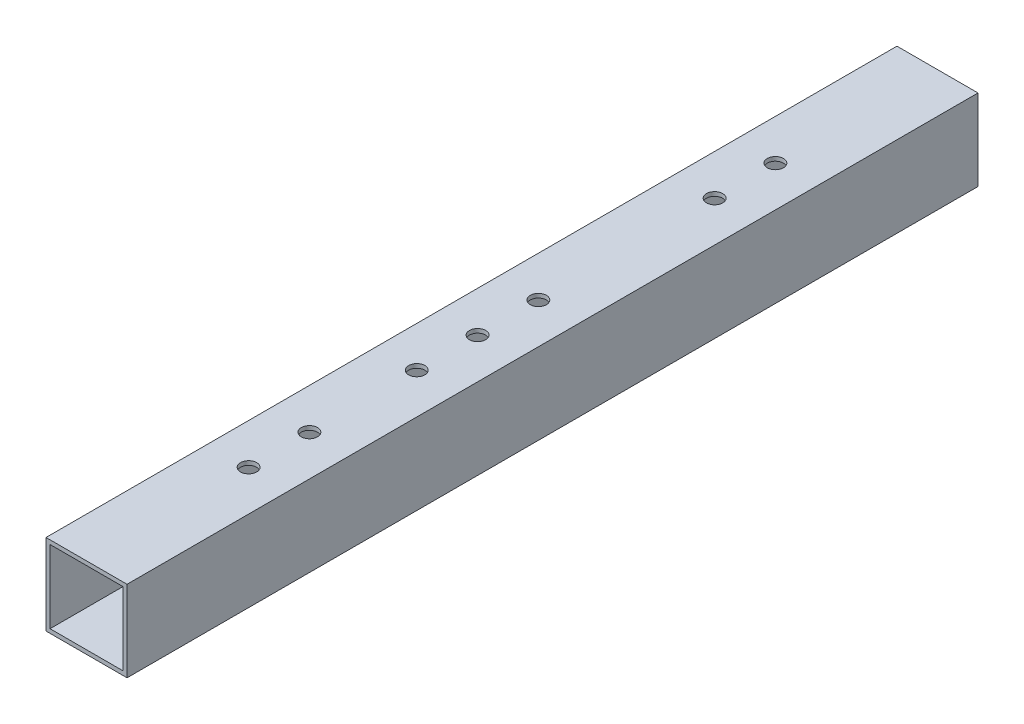
ISO-10303-21;
HEADER;
FILE_DESCRIPTION(('STEP AP214'),'2;1');
FILE_NAME('part.step','',(''),(''),'','','');
FILE_SCHEMA(('AUTOMOTIVE_DESIGN { 1 0 10303 214 1 1 1 1 }'));
ENDSEC;
DATA;
#1=APPLICATION_CONTEXT('core data for automotive mechanical design processes');
#2=APPLICATION_PROTOCOL_DEFINITION('international standard','automotive_design',2000,#1);
#3=PRODUCT_CONTEXT('',#1,'mechanical');
#4=PRODUCT('Part','Part','',(#3));
#5=PRODUCT_RELATED_PRODUCT_CATEGORY('part','',(#4));
#6=PRODUCT_DEFINITION_FORMATION('','',#4);
#7=PRODUCT_DEFINITION_CONTEXT('part definition',#1,'design');
#8=PRODUCT_DEFINITION('design','',#6,#7);
#9=PRODUCT_DEFINITION_SHAPE('','',#8);
#10=(LENGTH_UNIT() NAMED_UNIT(*) SI_UNIT(.MILLI.,.METRE.));
#11=(NAMED_UNIT(*) PLANE_ANGLE_UNIT() SI_UNIT($,.RADIAN.));
#12=(NAMED_UNIT(*) SI_UNIT($,.STERADIAN.) SOLID_ANGLE_UNIT());
#13=UNCERTAINTY_MEASURE_WITH_UNIT(LENGTH_MEASURE(1.E-05),#10,'distance_accuracy_value','');
#14=(GEOMETRIC_REPRESENTATION_CONTEXT(3) GLOBAL_UNCERTAINTY_ASSIGNED_CONTEXT((#13)) GLOBAL_UNIT_ASSIGNED_CONTEXT((#10,
#11,#12)) REPRESENTATION_CONTEXT('',''));
#15=CARTESIAN_POINT('',(0.,0.,0.));
#16=DIRECTION('',(0.,0.,1.));
#17=DIRECTION('',(1.,0.,0.));
#18=AXIS2_PLACEMENT_3D('',#15,#16,#17);
#19=CARTESIAN_POINT('',(0.,0.,105.));
#20=DIRECTION('',(0.,0.,-1.));
#21=DIRECTION('',(-1.,0.,0.));
#22=AXIS2_PLACEMENT_3D('',#19,#20,#21);
#23=PLANE('',#22);
#24=DIRECTION('',(0.,1.,0.));
#25=VECTOR('',#24,1.);
#26=CARTESIAN_POINT('',(10.,-10.,105.));
#27=LINE('',#26,#25);
#28=CARTESIAN_POINT('',(10.,-10.,105.));
#29=VERTEX_POINT('',#28);
#30=CARTESIAN_POINT('',(10.,10.,105.));
#31=VERTEX_POINT('',#30);
#32=EDGE_CURVE('E148',#29,#31,#27,.T.);
#33=ORIENTED_EDGE('',*,*,#32,.T.);
#34=DIRECTION('',(-1.,0.,0.));
#35=VECTOR('',#34,1.);
#36=CARTESIAN_POINT('',(-10.,10.,105.));
#37=LINE('',#36,#35);
#38=CARTESIAN_POINT('',(-10.,10.,105.));
#39=VERTEX_POINT('',#38);
#40=EDGE_CURVE('E151',#31,#39,#37,.T.);
#41=ORIENTED_EDGE('',*,*,#40,.T.);
#42=DIRECTION('',(0.,-1.,0.));
#43=VECTOR('',#42,1.);
#44=CARTESIAN_POINT('',(-10.,-10.,105.));
#45=LINE('',#44,#43);
#46=CARTESIAN_POINT('',(-10.,-10.,105.));
#47=VERTEX_POINT('',#46);
#48=EDGE_CURVE('E154',#39,#47,#45,.T.);
#49=ORIENTED_EDGE('',*,*,#48,.T.);
#50=DIRECTION('',(1.,0.,0.));
#51=VECTOR('',#50,1.);
#52=CARTESIAN_POINT('',(-10.,-10.,105.));
#53=LINE('',#52,#51);
#54=EDGE_CURVE('E156',#47,#29,#53,.T.);
#55=ORIENTED_EDGE('',*,*,#54,.T.);
#56=EDGE_LOOP('',(#33,#41,#49,#55));
#57=FACE_BOUND('',#56,.T.);
#58=DIRECTION('',(0.,1.,0.));
#59=VECTOR('',#58,1.);
#60=CARTESIAN_POINT('',(9.,9.,105.));
#61=LINE('',#60,#59);
#62=CARTESIAN_POINT('',(9.,-9.,105.));
#63=VERTEX_POINT('',#62);
#64=CARTESIAN_POINT('',(9.,9.,105.));
#65=VERTEX_POINT('',#64);
#66=EDGE_CURVE('E110',#63,#65,#61,.T.);
#67=ORIENTED_EDGE('',*,*,#66,.F.);
#68=DIRECTION('',(1.,0.,0.));
#69=VECTOR('',#68,1.);
#70=CARTESIAN_POINT('',(-9.,-9.,105.));
#71=LINE('',#70,#69);
#72=CARTESIAN_POINT('',(-9.,-9.,105.));
#73=VERTEX_POINT('',#72);
#74=EDGE_CURVE('E132',#73,#63,#71,.T.);
#75=ORIENTED_EDGE('',*,*,#74,.F.);
#76=DIRECTION('',(0.,-1.,0.));
#77=VECTOR('',#76,1.);
#78=CARTESIAN_POINT('',(-9.,9.,105.));
#79=LINE('',#78,#77);
#80=CARTESIAN_POINT('',(-9.,9.,105.));
#81=VERTEX_POINT('',#80);
#82=EDGE_CURVE('E130',#81,#73,#79,.T.);
#83=ORIENTED_EDGE('',*,*,#82,.F.);
#84=DIRECTION('',(-1.,0.,0.));
#85=VECTOR('',#84,1.);
#86=CARTESIAN_POINT('',(-9.,9.,105.));
#87=LINE('',#86,#85);
#88=EDGE_CURVE('E118',#65,#81,#87,.T.);
#89=ORIENTED_EDGE('',*,*,#88,.F.);
#90=EDGE_LOOP('',(#67,#75,#83,#89));
#91=FACE_BOUND('',#90,.T.);
#92=ADVANCED_FACE('F43',(#57,#91),#23,.F.);
#93=CARTESIAN_POINT('',(0.,0.,-105.));
#94=DIRECTION('',(0.,0.,-1.));
#95=DIRECTION('',(-1.,0.,0.));
#96=AXIS2_PLACEMENT_3D('',#93,#94,#95);
#97=PLANE('',#96);
#98=DIRECTION('',(0.,1.,0.));
#99=VECTOR('',#98,1.);
#100=CARTESIAN_POINT('',(10.,-10.,-105.));
#101=LINE('',#100,#99);
#102=CARTESIAN_POINT('',(10.,-10.,-105.));
#103=VERTEX_POINT('',#102);
#104=CARTESIAN_POINT('',(10.,10.,-105.));
#105=VERTEX_POINT('',#104);
#106=EDGE_CURVE('E126',#103,#105,#101,.T.);
#107=ORIENTED_EDGE('',*,*,#106,.F.);
#108=DIRECTION('',(1.,0.,0.));
#109=VECTOR('',#108,1.);
#110=CARTESIAN_POINT('',(-10.,-10.,-105.));
#111=LINE('',#110,#109);
#112=CARTESIAN_POINT('',(-10.,-10.,-105.));
#113=VERTEX_POINT('',#112);
#114=EDGE_CURVE('E152',#113,#103,#111,.T.);
#115=ORIENTED_EDGE('',*,*,#114,.F.);
#116=DIRECTION('',(0.,-1.,0.));
#117=VECTOR('',#116,1.);
#118=CARTESIAN_POINT('',(-10.,-10.,-105.));
#119=LINE('',#118,#117);
#120=CARTESIAN_POINT('',(-10.,10.,-105.));
#121=VERTEX_POINT('',#120);
#122=EDGE_CURVE('E163',#121,#113,#119,.T.);
#123=ORIENTED_EDGE('',*,*,#122,.F.);
#124=DIRECTION('',(-1.,0.,0.));
#125=VECTOR('',#124,1.);
#126=CARTESIAN_POINT('',(-10.,10.,-105.));
#127=LINE('',#126,#125);
#128=EDGE_CURVE('E161',#105,#121,#127,.T.);
#129=ORIENTED_EDGE('',*,*,#128,.F.);
#130=EDGE_LOOP('',(#107,#115,#123,#129));
#131=FACE_BOUND('',#130,.T.);
#132=DIRECTION('',(1.,0.,0.));
#133=VECTOR('',#132,1.);
#134=CARTESIAN_POINT('',(-9.,-9.,-105.));
#135=LINE('',#134,#133);
#136=CARTESIAN_POINT('',(-9.,-9.,-105.));
#137=VERTEX_POINT('',#136);
#138=CARTESIAN_POINT('',(9.,-9.,-105.));
#139=VERTEX_POINT('',#138);
#140=EDGE_CURVE('E119',#137,#139,#135,.T.);
#141=ORIENTED_EDGE('',*,*,#140,.T.);
#142=DIRECTION('',(0.,1.,0.));
#143=VECTOR('',#142,1.);
#144=CARTESIAN_POINT('',(9.,9.,-105.));
#145=LINE('',#144,#143);
#146=CARTESIAN_POINT('',(9.,9.,-105.));
#147=VERTEX_POINT('',#146);
#148=EDGE_CURVE('E68',#139,#147,#145,.T.);
#149=ORIENTED_EDGE('',*,*,#148,.T.);
#150=DIRECTION('',(-1.,0.,0.));
#151=VECTOR('',#150,1.);
#152=CARTESIAN_POINT('',(-9.,9.,-105.));
#153=LINE('',#152,#151);
#154=CARTESIAN_POINT('',(-9.,9.,-105.));
#155=VERTEX_POINT('',#154);
#156=EDGE_CURVE('E125',#147,#155,#153,.T.);
#157=ORIENTED_EDGE('',*,*,#156,.T.);
#158=DIRECTION('',(0.,-1.,0.));
#159=VECTOR('',#158,1.);
#160=CARTESIAN_POINT('',(-9.,9.,-105.));
#161=LINE('',#160,#159);
#162=EDGE_CURVE('E140',#155,#137,#161,.T.);
#163=ORIENTED_EDGE('',*,*,#162,.T.);
#164=EDGE_LOOP('',(#141,#149,#157,#163));
#165=FACE_BOUND('',#164,.T.);
#166=ADVANCED_FACE('F279',(#131,#165),#97,.T.);
#167=CARTESIAN_POINT('',(10.,-10.,105.));
#168=DIRECTION('',(-1.,0.,0.));
#169=DIRECTION('',(0.,-1.,0.));
#170=AXIS2_PLACEMENT_3D('',#167,#168,#169);
#171=PLANE('',#170);
#172=ORIENTED_EDGE('',*,*,#106,.T.);
#173=DIRECTION('',(0.,0.,-1.));
#174=VECTOR('',#173,1.);
#175=CARTESIAN_POINT('',(10.,10.,105.));
#176=LINE('',#175,#174);
#177=EDGE_CURVE('E11',#31,#105,#176,.T.);
#178=ORIENTED_EDGE('',*,*,#177,.F.);
#179=ORIENTED_EDGE('',*,*,#32,.F.);
#180=DIRECTION('',(0.,0.,-1.));
#181=VECTOR('',#180,1.);
#182=CARTESIAN_POINT('',(10.,-10.,105.));
#183=LINE('',#182,#181);
#184=EDGE_CURVE('E158',#29,#103,#183,.T.);
#185=ORIENTED_EDGE('',*,*,#184,.T.);
#186=EDGE_LOOP('',(#172,#178,#179,#185));
#187=FACE_BOUND('',#186,.T.);
#188=ADVANCED_FACE('F45',(#187),#171,.F.);
#189=CARTESIAN_POINT('',(-10.,10.,105.));
#190=DIRECTION('',(0.,-1.,0.));
#191=DIRECTION('',(1.,0.,0.));
#192=AXIS2_PLACEMENT_3D('',#189,#190,#191);
#193=PLANE('',#192);
#194=CARTESIAN_POINT('',(0.,10.,23.5));
#195=DIRECTION('',(0.,1.,0.));
#196=DIRECTION('',(-1.,0.,0.));
#197=AXIS2_PLACEMENT_3D('',#194,#195,#196);
#198=CIRCLE('',#197,2.);
#199=CARTESIAN_POINT('',(-2.,10.,23.5));
#200=VERTEX_POINT('',#199);
#201=EDGE_CURVE('E543',#200,#200,#198,.T.);
#202=ORIENTED_EDGE('',*,*,#201,.F.);
#203=EDGE_LOOP('',(#202));
#204=FACE_BOUND('',#203,.T.);
#205=CARTESIAN_POINT('',(0.,10.,-6.50000000000001));
#206=DIRECTION('',(0.,1.,0.));
#207=DIRECTION('',(-1.,0.,0.));
#208=AXIS2_PLACEMENT_3D('',#205,#206,#207);
#209=CIRCLE('',#208,2.);
#210=CARTESIAN_POINT('',(-2.,10.,-6.50000000000001));
#211=VERTEX_POINT('',#210);
#212=EDGE_CURVE('E548',#211,#211,#209,.T.);
#213=ORIENTED_EDGE('',*,*,#212,.F.);
#214=EDGE_LOOP('',(#213));
#215=FACE_BOUND('',#214,.T.);
#216=CARTESIAN_POINT('',(0.,10.,8.49999999999999));
#217=DIRECTION('',(0.,1.,0.));
#218=DIRECTION('',(-1.,0.,0.));
#219=AXIS2_PLACEMENT_3D('',#216,#217,#218);
#220=CIRCLE('',#219,2.);
#221=CARTESIAN_POINT('',(-2.,10.,8.49999999999999));
#222=VERTEX_POINT('',#221);
#223=EDGE_CURVE('E205',#222,#222,#220,.T.);
#224=ORIENTED_EDGE('',*,*,#223,.F.);
#225=EDGE_LOOP('',(#224));
#226=FACE_BOUND('',#225,.T.);
#227=CARTESIAN_POINT('',(0.,10.,-65.));
#228=DIRECTION('',(0.,1.,0.));
#229=DIRECTION('',(-1.,0.,0.));
#230=AXIS2_PLACEMENT_3D('',#227,#228,#229);
#231=CIRCLE('',#230,2.);
#232=CARTESIAN_POINT('',(-2.,10.,-65.));
#233=VERTEX_POINT('',#232);
#234=EDGE_CURVE('E214',#233,#233,#231,.T.);
#235=ORIENTED_EDGE('',*,*,#234,.F.);
#236=EDGE_LOOP('',(#235));
#237=FACE_BOUND('',#236,.T.);
#238=CARTESIAN_POINT('',(0.,10.,65.));
#239=DIRECTION('',(0.,1.,0.));
#240=DIRECTION('',(-1.,0.,0.));
#241=AXIS2_PLACEMENT_3D('',#238,#239,#240);
#242=CIRCLE('',#241,2.);
#243=CARTESIAN_POINT('',(-2.00000000000001,10.,65.));
#244=VERTEX_POINT('',#243);
#245=EDGE_CURVE('E217',#244,#244,#242,.T.);
#246=ORIENTED_EDGE('',*,*,#245,.F.);
#247=EDGE_LOOP('',(#246));
#248=FACE_BOUND('',#247,.T.);
#249=CARTESIAN_POINT('',(0.,10.,50.));
#250=DIRECTION('',(0.,1.,0.));
#251=DIRECTION('',(-1.,0.,0.));
#252=AXIS2_PLACEMENT_3D('',#249,#250,#251);
#253=CIRCLE('',#252,2.);
#254=CARTESIAN_POINT('',(-2.,10.,50.));
#255=VERTEX_POINT('',#254);
#256=EDGE_CURVE('E223',#255,#255,#253,.T.);
#257=ORIENTED_EDGE('',*,*,#256,.F.);
#258=EDGE_LOOP('',(#257));
#259=FACE_BOUND('',#258,.T.);
#260=CARTESIAN_POINT('',(0.,10.,-50.));
#261=DIRECTION('',(0.,1.,0.));
#262=DIRECTION('',(-1.,0.,0.));
#263=AXIS2_PLACEMENT_3D('',#260,#261,#262);
#264=CIRCLE('',#263,2.);
#265=CARTESIAN_POINT('',(-2.,10.,-50.));
#266=VERTEX_POINT('',#265);
#267=EDGE_CURVE('E229',#266,#266,#264,.T.);
#268=ORIENTED_EDGE('',*,*,#267,.F.);
#269=EDGE_LOOP('',(#268));
#270=FACE_BOUND('',#269,.T.);
#271=ORIENTED_EDGE('',*,*,#128,.T.);
#272=DIRECTION('',(0.,0.,-1.));
#273=VECTOR('',#272,1.);
#274=CARTESIAN_POINT('',(-10.,10.,105.));
#275=LINE('',#274,#273);
#276=EDGE_CURVE('E52',#39,#121,#275,.T.);
#277=ORIENTED_EDGE('',*,*,#276,.F.);
#278=ORIENTED_EDGE('',*,*,#40,.F.);
#279=ORIENTED_EDGE('',*,*,#177,.T.);
#280=EDGE_LOOP('',(#271,#277,#278,#279));
#281=FACE_BOUND('',#280,.T.);
#282=ADVANCED_FACE('F265',(#204,#215,#226,#237,#248,#259,#270,#281),#193,.F.);
#283=CARTESIAN_POINT('',(-10.,-10.,105.));
#284=DIRECTION('',(1.,0.,0.));
#285=DIRECTION('',(0.,1.,0.));
#286=AXIS2_PLACEMENT_3D('',#283,#284,#285);
#287=PLANE('',#286);
#288=ORIENTED_EDGE('',*,*,#122,.T.);
#289=DIRECTION('',(0.,0.,-1.));
#290=VECTOR('',#289,1.);
#291=CARTESIAN_POINT('',(-10.,-10.,105.));
#292=LINE('',#291,#290);
#293=EDGE_CURVE('E168',#47,#113,#292,.T.);
#294=ORIENTED_EDGE('',*,*,#293,.F.);
#295=ORIENTED_EDGE('',*,*,#48,.F.);
#296=ORIENTED_EDGE('',*,*,#276,.T.);
#297=EDGE_LOOP('',(#288,#294,#295,#296));
#298=FACE_BOUND('',#297,.T.);
#299=ADVANCED_FACE('F268',(#298),#287,.F.);
#300=CARTESIAN_POINT('',(-10.,-10.,105.));
#301=DIRECTION('',(0.,1.,0.));
#302=DIRECTION('',(-1.,0.,0.));
#303=AXIS2_PLACEMENT_3D('',#300,#301,#302);
#304=PLANE('',#303);
#305=CARTESIAN_POINT('',(0.,-10.,23.5));
#306=DIRECTION('',(0.,1.,0.));
#307=DIRECTION('',(-1.,0.,0.));
#308=AXIS2_PLACEMENT_3D('',#305,#306,#307);
#309=CIRCLE('',#308,2.);
#310=CARTESIAN_POINT('',(-2.,-10.,23.5));
#311=VERTEX_POINT('',#310);
#312=EDGE_CURVE('E545',#311,#311,#309,.T.);
#313=ORIENTED_EDGE('',*,*,#312,.T.);
#314=EDGE_LOOP('',(#313));
#315=FACE_BOUND('',#314,.T.);
#316=CARTESIAN_POINT('',(0.,-10.,-6.50000000000001));
#317=DIRECTION('',(0.,1.,0.));
#318=DIRECTION('',(-1.,0.,0.));
#319=AXIS2_PLACEMENT_3D('',#316,#317,#318);
#320=CIRCLE('',#319,2.);
#321=CARTESIAN_POINT('',(-2.,-10.,-6.50000000000001));
#322=VERTEX_POINT('',#321);
#323=EDGE_CURVE('E544',#322,#322,#320,.T.);
#324=ORIENTED_EDGE('',*,*,#323,.T.);
#325=EDGE_LOOP('',(#324));
#326=FACE_BOUND('',#325,.T.);
#327=CARTESIAN_POINT('',(0.,-10.,8.49999999999999));
#328=DIRECTION('',(0.,1.,0.));
#329=DIRECTION('',(-1.,0.,0.));
#330=AXIS2_PLACEMENT_3D('',#327,#328,#329);
#331=CIRCLE('',#330,2.);
#332=CARTESIAN_POINT('',(-2.,-10.,8.49999999999999));
#333=VERTEX_POINT('',#332);
#334=EDGE_CURVE('E192',#333,#333,#331,.T.);
#335=ORIENTED_EDGE('',*,*,#334,.T.);
#336=EDGE_LOOP('',(#335));
#337=FACE_BOUND('',#336,.T.);
#338=CARTESIAN_POINT('',(0.,-10.,-65.));
#339=DIRECTION('',(0.,1.,0.));
#340=DIRECTION('',(-1.,0.,0.));
#341=AXIS2_PLACEMENT_3D('',#338,#339,#340);
#342=CIRCLE('',#341,2.);
#343=CARTESIAN_POINT('',(-2.,-10.,-65.));
#344=VERTEX_POINT('',#343);
#345=EDGE_CURVE('E177',#344,#344,#342,.T.);
#346=ORIENTED_EDGE('',*,*,#345,.T.);
#347=EDGE_LOOP('',(#346));
#348=FACE_BOUND('',#347,.T.);
#349=CARTESIAN_POINT('',(0.,-10.,65.));
#350=DIRECTION('',(0.,1.,0.));
#351=DIRECTION('',(-1.,0.,0.));
#352=AXIS2_PLACEMENT_3D('',#349,#350,#351);
#353=CIRCLE('',#352,2.);
#354=CARTESIAN_POINT('',(-2.,-10.,65.));
#355=VERTEX_POINT('',#354);
#356=EDGE_CURVE('E220',#355,#355,#353,.T.);
#357=ORIENTED_EDGE('',*,*,#356,.T.);
#358=EDGE_LOOP('',(#357));
#359=FACE_BOUND('',#358,.T.);
#360=CARTESIAN_POINT('',(0.,-10.,50.));
#361=DIRECTION('',(0.,1.,0.));
#362=DIRECTION('',(-1.,0.,0.));
#363=AXIS2_PLACEMENT_3D('',#360,#361,#362);
#364=CIRCLE('',#363,2.);
#365=CARTESIAN_POINT('',(-2.,-10.,50.));
#366=VERTEX_POINT('',#365);
#367=EDGE_CURVE('E226',#366,#366,#364,.T.);
#368=ORIENTED_EDGE('',*,*,#367,.T.);
#369=EDGE_LOOP('',(#368));
#370=FACE_BOUND('',#369,.T.);
#371=CARTESIAN_POINT('',(0.,-10.,-50.));
#372=DIRECTION('',(0.,1.,0.));
#373=DIRECTION('',(-1.,0.,0.));
#374=AXIS2_PLACEMENT_3D('',#371,#372,#373);
#375=CIRCLE('',#374,2.);
#376=CARTESIAN_POINT('',(-2.,-10.,-50.));
#377=VERTEX_POINT('',#376);
#378=EDGE_CURVE('E211',#377,#377,#375,.T.);
#379=ORIENTED_EDGE('',*,*,#378,.T.);
#380=EDGE_LOOP('',(#379));
#381=FACE_BOUND('',#380,.T.);
#382=ORIENTED_EDGE('',*,*,#114,.T.);
#383=ORIENTED_EDGE('',*,*,#184,.F.);
#384=ORIENTED_EDGE('',*,*,#54,.F.);
#385=ORIENTED_EDGE('',*,*,#293,.T.);
#386=EDGE_LOOP('',(#382,#383,#384,#385));
#387=FACE_BOUND('',#386,.T.);
#388=ADVANCED_FACE('F283',(#315,#326,#337,#348,#359,#370,#381,#387),#304,.F.);
#389=CARTESIAN_POINT('',(9.,9.,105.));
#390=DIRECTION('',(-1.,0.,0.));
#391=DIRECTION('',(0.,-1.,0.));
#392=AXIS2_PLACEMENT_3D('',#389,#390,#391);
#393=PLANE('',#392);
#394=ORIENTED_EDGE('',*,*,#148,.F.);
#395=DIRECTION('',(0.,0.,-1.));
#396=VECTOR('',#395,1.);
#397=CARTESIAN_POINT('',(9.,-9.,105.));
#398=LINE('',#397,#396);
#399=EDGE_CURVE('E114',#63,#139,#398,.T.);
#400=ORIENTED_EDGE('',*,*,#399,.F.);
#401=ORIENTED_EDGE('',*,*,#66,.T.);
#402=DIRECTION('',(0.,0.,-1.));
#403=VECTOR('',#402,1.);
#404=CARTESIAN_POINT('',(9.,9.,105.));
#405=LINE('',#404,#403);
#406=EDGE_CURVE('E113',#65,#147,#405,.T.);
#407=ORIENTED_EDGE('',*,*,#406,.T.);
#408=EDGE_LOOP('',(#394,#400,#401,#407));
#409=FACE_BOUND('',#408,.T.);
#410=ADVANCED_FACE('F112',(#409),#393,.T.);
#411=CARTESIAN_POINT('',(-9.,9.,105.));
#412=DIRECTION('',(0.,-1.,0.));
#413=DIRECTION('',(0.,0.,-1.));
#414=AXIS2_PLACEMENT_3D('',#411,#412,#413);
#415=PLANE('',#414);
#416=CARTESIAN_POINT('',(0.,9.,23.5));
#417=DIRECTION('',(0.,-1.,0.));
#418=DIRECTION('',(0.,0.,-1.));
#419=AXIS2_PLACEMENT_3D('',#416,#417,#418);
#420=CIRCLE('',#419,2.);
#421=CARTESIAN_POINT('',(0.,9.,21.5));
#422=VERTEX_POINT('',#421);
#423=EDGE_CURVE('E208',#422,#422,#420,.T.);
#424=ORIENTED_EDGE('',*,*,#423,.F.);
#425=EDGE_LOOP('',(#424));
#426=FACE_BOUND('',#425,.T.);
#427=CARTESIAN_POINT('',(0.,9.,-6.50000000000001));
#428=DIRECTION('',(0.,-1.,0.));
#429=DIRECTION('',(0.,0.,-1.));
#430=AXIS2_PLACEMENT_3D('',#427,#428,#429);
#431=CIRCLE('',#430,2.);
#432=CARTESIAN_POINT('',(0.,9.,-8.50000000000001));
#433=VERTEX_POINT('',#432);
#434=EDGE_CURVE('E195',#433,#433,#431,.T.);
#435=ORIENTED_EDGE('',*,*,#434,.F.);
#436=EDGE_LOOP('',(#435));
#437=FACE_BOUND('',#436,.T.);
#438=CARTESIAN_POINT('',(0.,9.,8.49999999999999));
#439=DIRECTION('',(0.,-1.,0.));
#440=DIRECTION('',(0.,0.,-1.));
#441=AXIS2_PLACEMENT_3D('',#438,#439,#440);
#442=CIRCLE('',#441,2.);
#443=CARTESIAN_POINT('',(0.,9.,6.49999999999999));
#444=VERTEX_POINT('',#443);
#445=EDGE_CURVE('E191',#444,#444,#442,.T.);
#446=ORIENTED_EDGE('',*,*,#445,.F.);
#447=EDGE_LOOP('',(#446));
#448=FACE_BOUND('',#447,.T.);
#449=CARTESIAN_POINT('',(0.,9.,-65.));
#450=DIRECTION('',(0.,-1.,0.));
#451=DIRECTION('',(0.,0.,-1.));
#452=AXIS2_PLACEMENT_3D('',#449,#450,#451);
#453=CIRCLE('',#452,2.);
#454=CARTESIAN_POINT('',(0.,9.,-67.));
#455=VERTEX_POINT('',#454);
#456=EDGE_CURVE('E138',#455,#455,#453,.T.);
#457=ORIENTED_EDGE('',*,*,#456,.F.);
#458=EDGE_LOOP('',(#457));
#459=FACE_BOUND('',#458,.T.);
#460=CARTESIAN_POINT('',(0.,9.,65.));
#461=DIRECTION('',(0.,-1.,0.));
#462=DIRECTION('',(0.,0.,-1.));
#463=AXIS2_PLACEMENT_3D('',#460,#461,#462);
#464=CIRCLE('',#463,2.);
#465=CARTESIAN_POINT('',(0.,9.,63.));
#466=VERTEX_POINT('',#465);
#467=EDGE_CURVE('E185',#466,#466,#464,.T.);
#468=ORIENTED_EDGE('',*,*,#467,.F.);
#469=EDGE_LOOP('',(#468));
#470=FACE_BOUND('',#469,.T.);
#471=CARTESIAN_POINT('',(0.,9.,50.));
#472=DIRECTION('',(0.,-1.,0.));
#473=DIRECTION('',(0.,0.,-1.));
#474=AXIS2_PLACEMENT_3D('',#471,#472,#473);
#475=CIRCLE('',#474,2.);
#476=CARTESIAN_POINT('',(0.,9.,48.));
#477=VERTEX_POINT('',#476);
#478=EDGE_CURVE('E181',#477,#477,#475,.T.);
#479=ORIENTED_EDGE('',*,*,#478,.F.);
#480=EDGE_LOOP('',(#479));
#481=FACE_BOUND('',#480,.T.);
#482=CARTESIAN_POINT('',(0.,9.,-50.));
#483=DIRECTION('',(0.,-1.,0.));
#484=DIRECTION('',(0.,0.,-1.));
#485=AXIS2_PLACEMENT_3D('',#482,#483,#484);
#486=CIRCLE('',#485,2.);
#487=CARTESIAN_POINT('',(0.,9.,-52.));
#488=VERTEX_POINT('',#487);
#489=EDGE_CURVE('E176',#488,#488,#486,.T.);
#490=ORIENTED_EDGE('',*,*,#489,.F.);
#491=EDGE_LOOP('',(#490));
#492=FACE_BOUND('',#491,.T.);
#493=ORIENTED_EDGE('',*,*,#156,.F.);
#494=ORIENTED_EDGE('',*,*,#406,.F.);
#495=ORIENTED_EDGE('',*,*,#88,.T.);
#496=DIRECTION('',(0.,0.,-1.));
#497=VECTOR('',#496,1.);
#498=CARTESIAN_POINT('',(-9.,9.,105.));
#499=LINE('',#498,#497);
#500=EDGE_CURVE('E127',#81,#155,#499,.T.);
#501=ORIENTED_EDGE('',*,*,#500,.T.);
#502=EDGE_LOOP('',(#493,#494,#495,#501));
#503=FACE_BOUND('',#502,.T.);
#504=ADVANCED_FACE('F122',(#426,#437,#448,#459,#470,#481,#492,#503),#415,.T.);
#505=CARTESIAN_POINT('',(-9.,9.,105.));
#506=DIRECTION('',(1.,0.,0.));
#507=DIRECTION('',(0.,1.,0.));
#508=AXIS2_PLACEMENT_3D('',#505,#506,#507);
#509=PLANE('',#508);
#510=ORIENTED_EDGE('',*,*,#162,.F.);
#511=ORIENTED_EDGE('',*,*,#500,.F.);
#512=ORIENTED_EDGE('',*,*,#82,.T.);
#513=DIRECTION('',(0.,0.,-1.));
#514=VECTOR('',#513,1.);
#515=CARTESIAN_POINT('',(-9.,-9.,105.));
#516=LINE('',#515,#514);
#517=EDGE_CURVE('E60',#73,#137,#516,.T.);
#518=ORIENTED_EDGE('',*,*,#517,.T.);
#519=EDGE_LOOP('',(#510,#511,#512,#518));
#520=FACE_BOUND('',#519,.T.);
#521=ADVANCED_FACE('F247',(#520),#509,.T.);
#522=CARTESIAN_POINT('',(-9.,-9.,105.));
#523=DIRECTION('',(0.,1.,0.));
#524=DIRECTION('',(-1.,0.,0.));
#525=AXIS2_PLACEMENT_3D('',#522,#523,#524);
#526=PLANE('',#525);
#527=CARTESIAN_POINT('',(0.,-9.,23.5));
#528=DIRECTION('',(0.,1.,0.));
#529=DIRECTION('',(-1.,0.,0.));
#530=AXIS2_PLACEMENT_3D('',#527,#528,#529);
#531=CIRCLE('',#530,2.);
#532=CARTESIAN_POINT('',(-2.,-9.,23.5));
#533=VERTEX_POINT('',#532);
#534=EDGE_CURVE('E47',#533,#533,#531,.T.);
#535=ORIENTED_EDGE('',*,*,#534,.F.);
#536=EDGE_LOOP('',(#535));
#537=FACE_BOUND('',#536,.T.);
#538=CARTESIAN_POINT('',(0.,-9.,-6.50000000000001));
#539=DIRECTION('',(0.,1.,0.));
#540=DIRECTION('',(-1.,0.,0.));
#541=AXIS2_PLACEMENT_3D('',#538,#539,#540);
#542=CIRCLE('',#541,2.);
#543=CARTESIAN_POINT('',(-2.,-9.,-6.50000000000001));
#544=VERTEX_POINT('',#543);
#545=EDGE_CURVE('E193',#544,#544,#542,.T.);
#546=ORIENTED_EDGE('',*,*,#545,.F.);
#547=EDGE_LOOP('',(#546));
#548=FACE_BOUND('',#547,.T.);
#549=CARTESIAN_POINT('',(0.,-9.,8.49999999999999));
#550=DIRECTION('',(0.,1.,0.));
#551=DIRECTION('',(-1.,0.,0.));
#552=AXIS2_PLACEMENT_3D('',#549,#550,#551);
#553=CIRCLE('',#552,2.);
#554=CARTESIAN_POINT('',(-2.,-9.,8.49999999999999));
#555=VERTEX_POINT('',#554);
#556=EDGE_CURVE('E189',#555,#555,#553,.T.);
#557=ORIENTED_EDGE('',*,*,#556,.F.);
#558=EDGE_LOOP('',(#557));
#559=FACE_BOUND('',#558,.T.);
#560=CARTESIAN_POINT('',(0.,-9.,-65.));
#561=DIRECTION('',(0.,1.,0.));
#562=DIRECTION('',(-1.,0.,0.));
#563=AXIS2_PLACEMENT_3D('',#560,#561,#562);
#564=CIRCLE('',#563,2.);
#565=CARTESIAN_POINT('',(-2.,-9.,-65.));
#566=VERTEX_POINT('',#565);
#567=EDGE_CURVE('E186',#566,#566,#564,.T.);
#568=ORIENTED_EDGE('',*,*,#567,.F.);
#569=EDGE_LOOP('',(#568));
#570=FACE_BOUND('',#569,.T.);
#571=CARTESIAN_POINT('',(0.,-9.,65.));
#572=DIRECTION('',(0.,1.,0.));
#573=DIRECTION('',(-1.,0.,0.));
#574=AXIS2_PLACEMENT_3D('',#571,#572,#573);
#575=CIRCLE('',#574,2.);
#576=CARTESIAN_POINT('',(-2.,-9.,65.));
#577=VERTEX_POINT('',#576);
#578=EDGE_CURVE('E182',#577,#577,#575,.T.);
#579=ORIENTED_EDGE('',*,*,#578,.F.);
#580=EDGE_LOOP('',(#579));
#581=FACE_BOUND('',#580,.T.);
#582=CARTESIAN_POINT('',(0.,-9.,50.));
#583=DIRECTION('',(0.,1.,0.));
#584=DIRECTION('',(-1.,0.,0.));
#585=AXIS2_PLACEMENT_3D('',#582,#583,#584);
#586=CIRCLE('',#585,2.);
#587=CARTESIAN_POINT('',(-2.,-9.,50.));
#588=VERTEX_POINT('',#587);
#589=EDGE_CURVE('E178',#588,#588,#586,.T.);
#590=ORIENTED_EDGE('',*,*,#589,.F.);
#591=EDGE_LOOP('',(#590));
#592=FACE_BOUND('',#591,.T.);
#593=CARTESIAN_POINT('',(0.,-9.,-50.));
#594=DIRECTION('',(0.,1.,0.));
#595=DIRECTION('',(-1.,0.,0.));
#596=AXIS2_PLACEMENT_3D('',#593,#594,#595);
#597=CIRCLE('',#596,2.);
#598=CARTESIAN_POINT('',(-2.,-9.,-50.));
#599=VERTEX_POINT('',#598);
#600=EDGE_CURVE('E173',#599,#599,#597,.T.);
#601=ORIENTED_EDGE('',*,*,#600,.F.);
#602=EDGE_LOOP('',(#601));
#603=FACE_BOUND('',#602,.T.);
#604=ORIENTED_EDGE('',*,*,#140,.F.);
#605=ORIENTED_EDGE('',*,*,#517,.F.);
#606=ORIENTED_EDGE('',*,*,#74,.T.);
#607=ORIENTED_EDGE('',*,*,#399,.T.);
#608=EDGE_LOOP('',(#604,#605,#606,#607));
#609=FACE_BOUND('',#608,.T.);
#610=ADVANCED_FACE('F326',(#537,#548,#559,#570,#581,#592,#603,#609),#526,.T.);
#611=CARTESIAN_POINT('',(0.,-10.,-50.));
#612=DIRECTION('',(0.,1.,0.));
#613=DIRECTION('',(-1.,0.,0.));
#614=AXIS2_PLACEMENT_3D('',#611,#612,#613);
#615=CYLINDRICAL_SURFACE('',#614,2.);
#616=ORIENTED_EDGE('',*,*,#600,.T.);
#617=EDGE_LOOP('',(#616));
#618=FACE_BOUND('',#617,.T.);
#619=ORIENTED_EDGE('',*,*,#378,.F.);
#620=EDGE_LOOP('',(#619));
#621=FACE_BOUND('',#620,.T.);
#622=ADVANCED_FACE('F262',(#618,#621),#615,.F.);
#623=CARTESIAN_POINT('',(0.,-10.,50.));
#624=DIRECTION('',(0.,1.,0.));
#625=DIRECTION('',(-1.,0.,0.));
#626=AXIS2_PLACEMENT_3D('',#623,#624,#625);
#627=CYLINDRICAL_SURFACE('',#626,2.);
#628=ORIENTED_EDGE('',*,*,#589,.T.);
#629=EDGE_LOOP('',(#628));
#630=FACE_BOUND('',#629,.T.);
#631=ORIENTED_EDGE('',*,*,#367,.F.);
#632=EDGE_LOOP('',(#631));
#633=FACE_BOUND('',#632,.T.);
#634=ADVANCED_FACE('F341',(#630,#633),#627,.F.);
#635=CARTESIAN_POINT('',(0.,-10.,65.));
#636=DIRECTION('',(0.,1.,0.));
#637=DIRECTION('',(-1.,0.,0.));
#638=AXIS2_PLACEMENT_3D('',#635,#636,#637);
#639=CYLINDRICAL_SURFACE('',#638,2.);
#640=ORIENTED_EDGE('',*,*,#578,.T.);
#641=EDGE_LOOP('',(#640));
#642=FACE_BOUND('',#641,.T.);
#643=ORIENTED_EDGE('',*,*,#356,.F.);
#644=EDGE_LOOP('',(#643));
#645=FACE_BOUND('',#644,.T.);
#646=ADVANCED_FACE('F348',(#642,#645),#639,.F.);
#647=CARTESIAN_POINT('',(0.,-10.,-65.));
#648=DIRECTION('',(0.,1.,0.));
#649=DIRECTION('',(-1.,0.,0.));
#650=AXIS2_PLACEMENT_3D('',#647,#648,#649);
#651=CYLINDRICAL_SURFACE('',#650,2.);
#652=ORIENTED_EDGE('',*,*,#567,.T.);
#653=EDGE_LOOP('',(#652));
#654=FACE_BOUND('',#653,.T.);
#655=ORIENTED_EDGE('',*,*,#345,.F.);
#656=EDGE_LOOP('',(#655));
#657=FACE_BOUND('',#656,.T.);
#658=ADVANCED_FACE('F260',(#654,#657),#651,.F.);
#659=ORIENTED_EDGE('',*,*,#489,.T.);
#660=EDGE_LOOP('',(#659));
#661=FACE_BOUND('',#660,.T.);
#662=ORIENTED_EDGE('',*,*,#267,.T.);
#663=EDGE_LOOP('',(#662));
#664=FACE_BOUND('',#663,.T.);
#665=ADVANCED_FACE('F256',(#661,#664),#615,.F.);
#666=ORIENTED_EDGE('',*,*,#478,.T.);
#667=EDGE_LOOP('',(#666));
#668=FACE_BOUND('',#667,.T.);
#669=ORIENTED_EDGE('',*,*,#256,.T.);
#670=EDGE_LOOP('',(#669));
#671=FACE_BOUND('',#670,.T.);
#672=ADVANCED_FACE('F259',(#668,#671),#627,.F.);
#673=ORIENTED_EDGE('',*,*,#467,.T.);
#674=EDGE_LOOP('',(#673));
#675=FACE_BOUND('',#674,.T.);
#676=ORIENTED_EDGE('',*,*,#245,.T.);
#677=EDGE_LOOP('',(#676));
#678=FACE_BOUND('',#677,.T.);
#679=ADVANCED_FACE('F358',(#675,#678),#639,.F.);
#680=ORIENTED_EDGE('',*,*,#456,.T.);
#681=EDGE_LOOP('',(#680));
#682=FACE_BOUND('',#681,.T.);
#683=ORIENTED_EDGE('',*,*,#234,.T.);
#684=EDGE_LOOP('',(#683));
#685=FACE_BOUND('',#684,.T.);
#686=ADVANCED_FACE('F242',(#682,#685),#651,.F.);
#687=CARTESIAN_POINT('',(0.,-10.,8.49999999999999));
#688=DIRECTION('',(0.,1.,0.));
#689=DIRECTION('',(-1.,0.,0.));
#690=AXIS2_PLACEMENT_3D('',#687,#688,#689);
#691=CYLINDRICAL_SURFACE('',#690,2.);
#692=ORIENTED_EDGE('',*,*,#556,.T.);
#693=EDGE_LOOP('',(#692));
#694=FACE_BOUND('',#693,.T.);
#695=ORIENTED_EDGE('',*,*,#334,.F.);
#696=EDGE_LOOP('',(#695));
#697=FACE_BOUND('',#696,.T.);
#698=ADVANCED_FACE('F387',(#694,#697),#691,.F.);
#699=CARTESIAN_POINT('',(0.,-10.,-6.50000000000001));
#700=DIRECTION('',(0.,1.,0.));
#701=DIRECTION('',(-1.,0.,0.));
#702=AXIS2_PLACEMENT_3D('',#699,#700,#701);
#703=CYLINDRICAL_SURFACE('',#702,2.);
#704=ORIENTED_EDGE('',*,*,#545,.T.);
#705=EDGE_LOOP('',(#704));
#706=FACE_BOUND('',#705,.T.);
#707=ORIENTED_EDGE('',*,*,#323,.F.);
#708=EDGE_LOOP('',(#707));
#709=FACE_BOUND('',#708,.T.);
#710=ADVANCED_FACE('F392',(#706,#709),#703,.F.);
#711=CARTESIAN_POINT('',(0.,-10.,23.5));
#712=DIRECTION('',(0.,1.,0.));
#713=DIRECTION('',(-1.,0.,0.));
#714=AXIS2_PLACEMENT_3D('',#711,#712,#713);
#715=CYLINDRICAL_SURFACE('',#714,2.);
#716=ORIENTED_EDGE('',*,*,#534,.T.);
#717=EDGE_LOOP('',(#716));
#718=FACE_BOUND('',#717,.T.);
#719=ORIENTED_EDGE('',*,*,#312,.F.);
#720=EDGE_LOOP('',(#719));
#721=FACE_BOUND('',#720,.T.);
#722=ADVANCED_FACE('F401',(#718,#721),#715,.F.);
#723=ORIENTED_EDGE('',*,*,#445,.T.);
#724=EDGE_LOOP('',(#723));
#725=FACE_BOUND('',#724,.T.);
#726=ORIENTED_EDGE('',*,*,#223,.T.);
#727=EDGE_LOOP('',(#726));
#728=FACE_BOUND('',#727,.T.);
#729=ADVANCED_FACE('F395',(#725,#728),#691,.F.);
#730=ORIENTED_EDGE('',*,*,#434,.T.);
#731=EDGE_LOOP('',(#730));
#732=FACE_BOUND('',#731,.T.);
#733=ORIENTED_EDGE('',*,*,#212,.T.);
#734=EDGE_LOOP('',(#733));
#735=FACE_BOUND('',#734,.T.);
#736=ADVANCED_FACE('F403',(#732,#735),#703,.F.);
#737=ORIENTED_EDGE('',*,*,#423,.T.);
#738=EDGE_LOOP('',(#737));
#739=FACE_BOUND('',#738,.T.);
#740=ORIENTED_EDGE('',*,*,#201,.T.);
#741=EDGE_LOOP('',(#740));
#742=FACE_BOUND('',#741,.T.);
#743=ADVANCED_FACE('F411',(#739,#742),#715,.F.);
#744=CLOSED_SHELL('',(#92,#166,#188,#282,#299,#388,#410,#504,#521,#610,#622,#634,#646,#658,#665,
#672,#679,#686,#698,#710,#722,#729,#736,#743));
#745=MANIFOLD_SOLID_BREP('B2',#744);
#746=ADVANCED_BREP_SHAPE_REPRESENTATION('',(#18,#745),#14);
#747=SHAPE_DEFINITION_REPRESENTATION(#9,#746);
ENDSEC;
END-ISO-10303-21;
